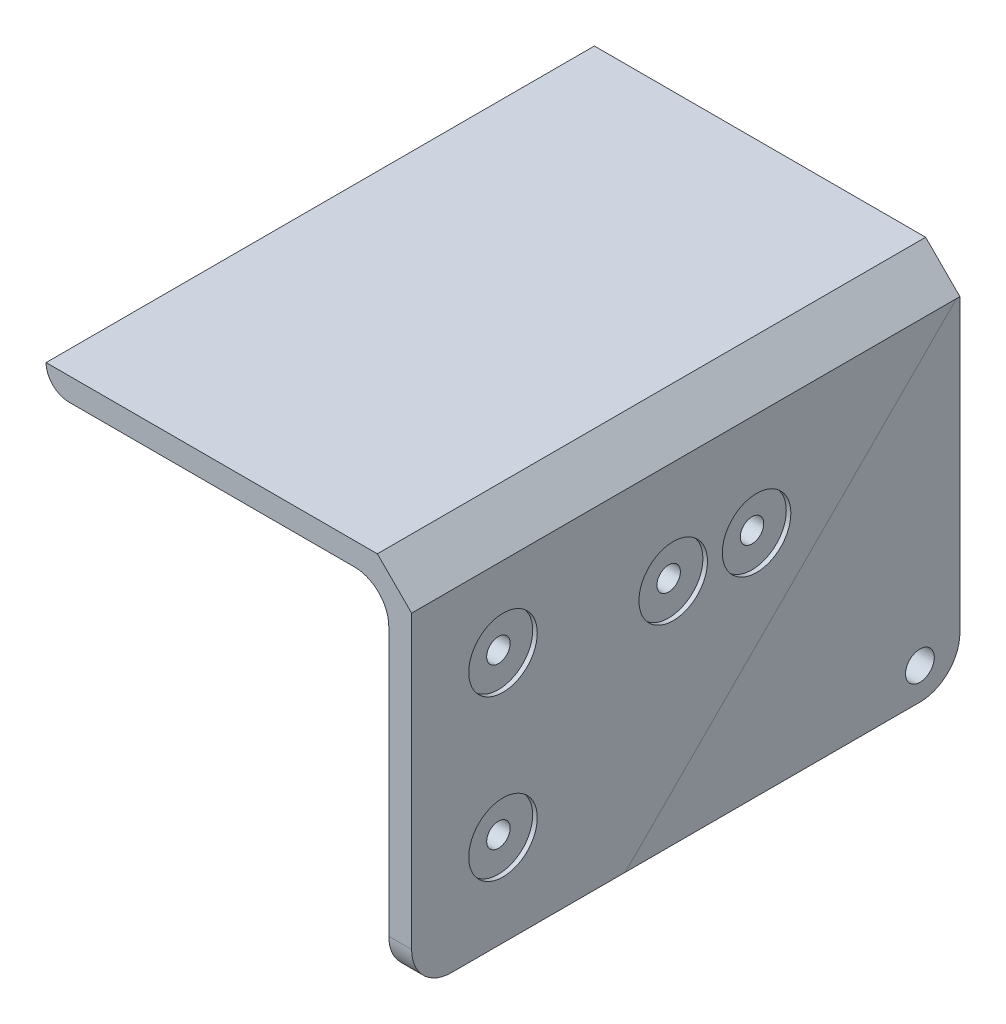
ISO-10303-21;
HEADER;
FILE_DESCRIPTION(('STEP AP214'),'2;1');
FILE_NAME('part.step','',(''),(''),'','','');
FILE_SCHEMA(('AUTOMOTIVE_DESIGN { 1 0 10303 214 1 1 1 1 }'));
ENDSEC;
DATA;
#1=APPLICATION_CONTEXT('core data for automotive mechanical design processes');
#2=APPLICATION_PROTOCOL_DEFINITION('international standard','automotive_design',2000,#1);
#3=PRODUCT_CONTEXT('',#1,'mechanical');
#4=PRODUCT('Part','Part','',(#3));
#5=PRODUCT_RELATED_PRODUCT_CATEGORY('part','',(#4));
#6=PRODUCT_DEFINITION_FORMATION('','',#4);
#7=PRODUCT_DEFINITION_CONTEXT('part definition',#1,'design');
#8=PRODUCT_DEFINITION('design','',#6,#7);
#9=PRODUCT_DEFINITION_SHAPE('','',#8);
#10=(LENGTH_UNIT() NAMED_UNIT(*) SI_UNIT(.MILLI.,.METRE.));
#11=(NAMED_UNIT(*) PLANE_ANGLE_UNIT() SI_UNIT($,.RADIAN.));
#12=(NAMED_UNIT(*) SI_UNIT($,.STERADIAN.) SOLID_ANGLE_UNIT());
#13=UNCERTAINTY_MEASURE_WITH_UNIT(LENGTH_MEASURE(1.E-05),#10,'distance_accuracy_value','');
#14=(GEOMETRIC_REPRESENTATION_CONTEXT(3) GLOBAL_UNCERTAINTY_ASSIGNED_CONTEXT((#13)) GLOBAL_UNIT_ASSIGNED_CONTEXT((#10,
#11,#12)) REPRESENTATION_CONTEXT('',''));
#15=CARTESIAN_POINT('',(0.,0.,0.));
#16=DIRECTION('',(0.,0.,1.));
#17=DIRECTION('',(1.,0.,0.));
#18=AXIS2_PLACEMENT_3D('',#15,#16,#17);
#19=CARTESIAN_POINT('',(0.,-61.8500668000245,-11.1125));
#20=DIRECTION('',(1.,0.,0.));
#21=DIRECTION('',(0.,0.,-1.));
#22=AXIS2_PLACEMENT_3D('',#19,#20,#21);
#23=PLANE('',#22);
#24=CARTESIAN_POINT('',(0.,-36.4500668000245,115.8875));
#25=DIRECTION('',(1.,0.,0.));
#26=DIRECTION('',(0.,0.,-1.));
#27=AXIS2_PLACEMENT_3D('',#24,#25,#26);
#28=CIRCLE('',#27,9.52500000000001);
#29=CARTESIAN_POINT('',(0.,-36.4500668000245,106.3625));
#30=VERTEX_POINT('',#29);
#31=EDGE_CURVE('E326',#30,#30,#28,.T.);
#32=ORIENTED_EDGE('',*,*,#31,.F.);
#33=EDGE_LOOP('',(#32));
#34=FACE_BOUND('',#33,.T.);
#35=CARTESIAN_POINT('',(0.,1.58750000000024,45.3997455688339));
#36=DIRECTION('',(1.,0.,0.));
#37=DIRECTION('',(0.,0.,-1.));
#38=AXIS2_PLACEMENT_3D('',#35,#36,#37);
#39=CIRCLE('',#38,9.52500000000001);
#40=CARTESIAN_POINT('',(0.,1.58750000000024,35.8747455688339));
#41=VERTEX_POINT('',#40);
#42=EDGE_CURVE('E317',#41,#41,#39,.T.);
#43=ORIENTED_EDGE('',*,*,#42,.F.);
#44=EDGE_LOOP('',(#43));
#45=FACE_BOUND('',#44,.T.);
#46=CARTESIAN_POINT('',(0.,1.58750000000024,68.5761787688339));
#47=DIRECTION('',(1.,0.,0.));
#48=DIRECTION('',(0.,0.,-1.));
#49=AXIS2_PLACEMENT_3D('',#46,#47,#48);
#50=CIRCLE('',#49,9.525);
#51=CARTESIAN_POINT('',(0.,1.58750000000024,59.0511787688339));
#52=VERTEX_POINT('',#51);
#53=EDGE_CURVE('E333',#52,#52,#50,.T.);
#54=ORIENTED_EDGE('',*,*,#53,.F.);
#55=EDGE_LOOP('',(#54));
#56=FACE_BOUND('',#55,.T.);
#57=CARTESIAN_POINT('',(0.,7.99993319997549,115.8875));
#58=DIRECTION('',(1.,0.,0.));
#59=DIRECTION('',(0.,0.,-1.));
#60=AXIS2_PLACEMENT_3D('',#57,#58,#59);
#61=CIRCLE('',#60,9.52500000000001);
#62=CARTESIAN_POINT('',(0.,7.99993319997549,106.3625));
#63=VERTEX_POINT('',#62);
#64=EDGE_CURVE('E307',#63,#63,#61,.T.);
#65=ORIENTED_EDGE('',*,*,#64,.F.);
#66=EDGE_LOOP('',(#65));
#67=FACE_BOUND('',#66,.T.);
#68=CARTESIAN_POINT('',(0.,-50.7375668000245,130.175));
#69=DIRECTION('',(-1.,0.,0.));
#70=DIRECTION('',(0.,0.,-1.));
#71=AXIS2_PLACEMENT_3D('',#68,#69,#70);
#72=CIRCLE('',#71,11.1125);
#73=CARTESIAN_POINT('',(0.,-61.8500668000245,130.175));
#74=VERTEX_POINT('',#73);
#75=CARTESIAN_POINT('',(0.,-50.7375668000245,141.2875));
#76=VERTEX_POINT('',#75);
#77=EDGE_CURVE('E347',#74,#76,#72,.T.);
#78=ORIENTED_EDGE('',*,*,#77,.F.);
#79=DIRECTION('',(0.,0.,1.));
#80=VECTOR('',#79,1.);
#81=CARTESIAN_POINT('',(0.,-61.8500668000245,-11.1125));
#82=LINE('',#81,#80);
#83=CARTESIAN_POINT('',(0.,-61.8500668000245,81.8965440056519));
#84=VERTEX_POINT('',#83);
#85=EDGE_CURVE('E175',#84,#74,#82,.T.);
#86=ORIENTED_EDGE('',*,*,#85,.F.);
#87=DIRECTION('',(0.,0.707106781186544,-0.707106781186551));
#88=VECTOR('',#87,1.);
#89=CARTESIAN_POINT('',(0.,-15.3455447971985,35.3920220028255));
#90=LINE('',#89,#88);
#91=CARTESIAN_POINT('',(0.,30.2249331999755,-10.178455994349));
#92=VERTEX_POINT('',#91);
#93=EDGE_CURVE('E359',#84,#92,#90,.T.);
#94=ORIENTED_EDGE('',*,*,#93,.T.);
#95=DIRECTION('',(0.,0.,1.));
#96=VECTOR('',#95,1.);
#97=CARTESIAN_POINT('',(0.,30.2249331999754,-11.1125));
#98=LINE('',#97,#96);
#99=CARTESIAN_POINT('',(0.,30.2249331999754,141.2875));
#100=VERTEX_POINT('',#99);
#101=EDGE_CURVE('E220',#92,#100,#98,.T.);
#102=ORIENTED_EDGE('',*,*,#101,.T.);
#103=DIRECTION('',(0.,1.,0.));
#104=VECTOR('',#103,1.);
#105=CARTESIAN_POINT('',(0.,-61.8500668000245,141.2875));
#106=LINE('',#105,#104);
#107=EDGE_CURVE('E283',#76,#100,#106,.T.);
#108=ORIENTED_EDGE('',*,*,#107,.F.);
#109=EDGE_LOOP('',(#78,#86,#94,#102,#108));
#110=FACE_BOUND('',#109,.T.);
#111=ADVANCED_FACE('F49',(#34,#45,#56,#67,#110),#23,.T.);
#112=CARTESIAN_POINT('',(0.,-53.06222052,0.));
#113=DIRECTION('',(1.,0.,0.));
#114=DIRECTION('',(0.,0.,-1.));
#115=AXIS2_PLACEMENT_3D('',#112,#113,#114);
#116=CIRCLE('',#115,4.000000001);
#117=CARTESIAN_POINT('',(0.,-53.06222052,-4.00000000100001));
#118=VERTEX_POINT('',#117);
#119=EDGE_CURVE('E302',#118,#118,#116,.T.);
#120=ORIENTED_EDGE('',*,*,#119,.F.);
#121=EDGE_LOOP('',(#120));
#122=FACE_BOUND('',#121,.T.);
#123=CARTESIAN_POINT('',(0.,-50.7375668000245,0.));
#124=DIRECTION('',(-1.,0.,0.));
#125=DIRECTION('',(0.,0.,-1.));
#126=AXIS2_PLACEMENT_3D('',#123,#124,#125);
#127=CIRCLE('',#126,11.1125);
#128=CARTESIAN_POINT('',(0.,-50.7375668000245,-11.1125));
#129=VERTEX_POINT('',#128);
#130=CARTESIAN_POINT('',(0.,-61.8500668000245,0.));
#131=VERTEX_POINT('',#130);
#132=EDGE_CURVE('E79',#129,#131,#127,.T.);
#133=ORIENTED_EDGE('',*,*,#132,.F.);
#134=DIRECTION('',(0.,1.,0.));
#135=VECTOR('',#134,1.);
#136=CARTESIAN_POINT('',(0.,-61.8500668000245,-11.1125));
#137=LINE('',#136,#135);
#138=CARTESIAN_POINT('',(0.,30.2249331999754,-11.1125));
#139=VERTEX_POINT('',#138);
#140=EDGE_CURVE('E156',#129,#139,#137,.T.);
#141=ORIENTED_EDGE('',*,*,#140,.T.);
#142=EDGE_CURVE('E362',#139,#92,#98,.T.);
#143=ORIENTED_EDGE('',*,*,#142,.T.);
#144=ORIENTED_EDGE('',*,*,#93,.F.);
#145=EDGE_CURVE('E159',#131,#84,#82,.T.);
#146=ORIENTED_EDGE('',*,*,#145,.F.);
#147=EDGE_LOOP('',(#133,#141,#143,#144,#146));
#148=FACE_BOUND('',#147,.T.);
#149=ADVANCED_FACE('F154',(#122,#148),#23,.T.);
#150=CARTESIAN_POINT('',(-6.35,-61.8500668000245,-11.1125));
#151=DIRECTION('',(1.,0.,0.));
#152=DIRECTION('',(0.,0.,-1.));
#153=AXIS2_PLACEMENT_3D('',#150,#151,#152);
#154=PLANE('',#153);
#155=CARTESIAN_POINT('',(-6.34999999999999,1.58750000000024,68.5761787688339));
#156=DIRECTION('',(1.,0.,0.));
#157=DIRECTION('',(0.,0.,-1.));
#158=AXIS2_PLACEMENT_3D('',#155,#156,#157);
#159=CIRCLE('',#158,3.26389999999999);
#160=CARTESIAN_POINT('',(-6.34999999999999,1.58750000000024,65.3122787688339));
#161=VERTEX_POINT('',#160);
#162=EDGE_CURVE('E297',#161,#161,#159,.T.);
#163=ORIENTED_EDGE('',*,*,#162,.T.);
#164=EDGE_LOOP('',(#163));
#165=FACE_BOUND('',#164,.T.);
#166=CARTESIAN_POINT('',(-6.34999999999999,1.58750000000024,45.3997455688339));
#167=DIRECTION('',(1.,0.,0.));
#168=DIRECTION('',(0.,0.,-1.));
#169=AXIS2_PLACEMENT_3D('',#166,#167,#168);
#170=CIRCLE('',#169,3.2639);
#171=CARTESIAN_POINT('',(-6.34999999999999,1.58750000000024,42.1358455688339));
#172=VERTEX_POINT('',#171);
#173=EDGE_CURVE('E442',#172,#172,#170,.T.);
#174=ORIENTED_EDGE('',*,*,#173,.T.);
#175=EDGE_LOOP('',(#174));
#176=FACE_BOUND('',#175,.T.);
#177=CARTESIAN_POINT('',(-6.34999999999999,-36.4500668000245,115.8875));
#178=DIRECTION('',(1.,0.,0.));
#179=DIRECTION('',(0.,0.,-1.));
#180=AXIS2_PLACEMENT_3D('',#177,#178,#179);
#181=CIRCLE('',#180,3.2639);
#182=CARTESIAN_POINT('',(-6.34999999999999,-36.4500668000245,112.6236));
#183=VERTEX_POINT('',#182);
#184=EDGE_CURVE('E447',#183,#183,#181,.T.);
#185=ORIENTED_EDGE('',*,*,#184,.T.);
#186=EDGE_LOOP('',(#185));
#187=FACE_BOUND('',#186,.T.);
#188=CARTESIAN_POINT('',(-6.34999999999999,7.99993319997549,115.8875));
#189=DIRECTION('',(1.,0.,0.));
#190=DIRECTION('',(0.,0.,-1.));
#191=AXIS2_PLACEMENT_3D('',#188,#189,#190);
#192=CIRCLE('',#191,3.26389999999999);
#193=CARTESIAN_POINT('',(-6.34999999999999,7.99993319997549,112.6236));
#194=VERTEX_POINT('',#193);
#195=EDGE_CURVE('E221',#194,#194,#192,.T.);
#196=ORIENTED_EDGE('',*,*,#195,.T.);
#197=EDGE_LOOP('',(#196));
#198=FACE_BOUND('',#197,.T.);
#199=DIRECTION('',(0.,1.,0.));
#200=VECTOR('',#199,1.);
#201=CARTESIAN_POINT('',(-6.35,-61.8500668000245,-11.1125));
#202=LINE('',#201,#200);
#203=CARTESIAN_POINT('',(-6.34999999999999,-50.7375668000245,-11.1125));
#204=VERTEX_POINT('',#203);
#205=CARTESIAN_POINT('',(-6.35,23.8749331999755,-11.1125));
#206=VERTEX_POINT('',#205);
#207=EDGE_CURVE('E170',#204,#206,#202,.T.);
#208=ORIENTED_EDGE('',*,*,#207,.F.);
#209=CARTESIAN_POINT('',(-6.34999999999999,-50.7375668000245,0.));
#210=DIRECTION('',(1.,0.,0.));
#211=DIRECTION('',(0.,0.,-1.));
#212=AXIS2_PLACEMENT_3D('',#209,#210,#211);
#213=CIRCLE('',#212,11.1125);
#214=CARTESIAN_POINT('',(-6.35,-55.5000668000245,-10.0402315710346));
#215=VERTEX_POINT('',#214);
#216=EDGE_CURVE('E146',#204,#215,#213,.F.);
#217=ORIENTED_EDGE('',*,*,#216,.T.);
#218=DIRECTION('',(0.,0.,1.));
#219=VECTOR('',#218,1.);
#220=CARTESIAN_POINT('',(-6.35,-55.5000668000245,-11.1125));
#221=LINE('',#220,#219);
#222=CARTESIAN_POINT('',(-6.35,-55.5000668000245,-3.17126244939943));
#223=VERTEX_POINT('',#222);
#224=EDGE_CURVE('E199',#215,#223,#221,.T.);
#225=ORIENTED_EDGE('',*,*,#224,.T.);
#226=CARTESIAN_POINT('',(-6.34999999999999,-53.06222052,0.));
#227=DIRECTION('',(1.,0.,0.));
#228=DIRECTION('',(0.,0.,-1.));
#229=AXIS2_PLACEMENT_3D('',#226,#227,#228);
#230=CIRCLE('',#229,4.000000001);
#231=CARTESIAN_POINT('',(-6.35,-55.5000668000245,3.17126244939941));
#232=VERTEX_POINT('',#231);
#233=EDGE_CURVE('E298',#223,#232,#230,.T.);
#234=ORIENTED_EDGE('',*,*,#233,.T.);
#235=CARTESIAN_POINT('',(-6.35,-55.5000668000245,140.215231571035));
#236=VERTEX_POINT('',#235);
#237=EDGE_CURVE('E198',#232,#236,#221,.T.);
#238=ORIENTED_EDGE('',*,*,#237,.T.);
#239=CARTESIAN_POINT('',(-6.34999999999999,-50.7375668000245,130.175));
#240=DIRECTION('',(1.,0.,0.));
#241=DIRECTION('',(0.,0.,-1.));
#242=AXIS2_PLACEMENT_3D('',#239,#240,#241);
#243=CIRCLE('',#242,11.1125);
#244=CARTESIAN_POINT('',(-6.34999999999999,-50.7375668000245,141.2875));
#245=VERTEX_POINT('',#244);
#246=EDGE_CURVE('E72',#236,#245,#243,.F.);
#247=ORIENTED_EDGE('',*,*,#246,.T.);
#248=DIRECTION('',(0.,1.,0.));
#249=VECTOR('',#248,1.);
#250=CARTESIAN_POINT('',(-6.35,-61.8500668000245,141.2875));
#251=LINE('',#250,#249);
#252=CARTESIAN_POINT('',(-6.35,23.8749331999755,141.2875));
#253=VERTEX_POINT('',#252);
#254=EDGE_CURVE('E288',#245,#253,#251,.T.);
#255=ORIENTED_EDGE('',*,*,#254,.T.);
#256=DIRECTION('',(0.,0.,1.));
#257=VECTOR('',#256,1.);
#258=CARTESIAN_POINT('',(-6.35,23.8749331999755,-11.1125));
#259=LINE('',#258,#257);
#260=EDGE_CURVE('E187',#253,#206,#259,.F.);
#261=ORIENTED_EDGE('',*,*,#260,.T.);
#262=EDGE_LOOP('',(#208,#217,#225,#234,#238,#247,#255,#261));
#263=FACE_BOUND('',#262,.T.);
#264=ADVANCED_FACE('F251',(#165,#176,#187,#198,#263),#154,.F.);
#265=CARTESIAN_POINT('',(0.,0.,-11.1125));
#266=DIRECTION('',(0.,0.,-1.));
#267=DIRECTION('',(-1.,0.,0.));
#268=AXIS2_PLACEMENT_3D('',#265,#266,#267);
#269=PLANE('',#268);
#270=ORIENTED_EDGE('',*,*,#140,.F.);
#271=DIRECTION('',(1.,0.,0.));
#272=VECTOR('',#271,1.);
#273=CARTESIAN_POINT('',(-101.6,-50.7375668000245,-11.1125));
#274=LINE('',#273,#272);
#275=EDGE_CURVE('E143',#204,#129,#274,.T.);
#276=ORIENTED_EDGE('',*,*,#275,.F.);
#277=ORIENTED_EDGE('',*,*,#207,.T.);
#278=CARTESIAN_POINT('',(-15.875,23.8749331999755,-11.1125));
#279=DIRECTION('',(0.,0.,-1.));
#280=DIRECTION('',(-1.,0.,0.));
#281=AXIS2_PLACEMENT_3D('',#278,#279,#280);
#282=CIRCLE('',#281,9.525);
#283=CARTESIAN_POINT('',(-15.875,33.3999331999755,-11.1125));
#284=VERTEX_POINT('',#283);
#285=EDGE_CURVE('E195',#206,#284,#282,.F.);
#286=ORIENTED_EDGE('',*,*,#285,.T.);
#287=DIRECTION('',(-1.,0.,0.));
#288=VECTOR('',#287,1.);
#289=CARTESIAN_POINT('',(0.,33.3999331999755,-11.1125));
#290=LINE('',#289,#288);
#291=CARTESIAN_POINT('',(-95.25,33.3999331999755,-11.1125));
#292=VERTEX_POINT('',#291);
#293=EDGE_CURVE('E177',#284,#292,#290,.T.);
#294=ORIENTED_EDGE('',*,*,#293,.T.);
#295=CARTESIAN_POINT('',(-95.25,39.7499331999755,-11.1125));
#296=DIRECTION('',(0.,0.,-1.));
#297=DIRECTION('',(-1.,0.,0.));
#298=AXIS2_PLACEMENT_3D('',#295,#296,#297);
#299=CIRCLE('',#298,6.35);
#300=CARTESIAN_POINT('',(-101.6,39.7499331999755,-11.1125));
#301=VERTEX_POINT('',#300);
#302=EDGE_CURVE('E205',#292,#301,#299,.T.);
#303=ORIENTED_EDGE('',*,*,#302,.T.);
#304=DIRECTION('',(-1.,0.,0.));
#305=VECTOR('',#304,1.);
#306=CARTESIAN_POINT('',(0.,39.7499331999755,-11.1125));
#307=LINE('',#306,#305);
#308=CARTESIAN_POINT('',(-9.52500000000008,39.7499331999755,-11.1125));
#309=VERTEX_POINT('',#308);
#310=EDGE_CURVE('E281',#309,#301,#307,.T.);
#311=ORIENTED_EDGE('',*,*,#310,.F.);
#312=DIRECTION('',(-0.707106781186548,0.707106781186547,0.));
#313=VECTOR('',#312,1.);
#314=CARTESIAN_POINT('',(15.1124665999877,15.1124665999877,-11.1125));
#315=LINE('',#314,#313);
#316=EDGE_CURVE('E166',#309,#139,#315,.F.);
#317=ORIENTED_EDGE('',*,*,#316,.T.);
#318=EDGE_LOOP('',(#270,#276,#277,#286,#294,#303,#311,#317));
#319=FACE_BOUND('',#318,.T.);
#320=ADVANCED_FACE('F163',(#319),#269,.T.);
#321=CARTESIAN_POINT('',(0.,0.,141.2875));
#322=DIRECTION('',(0.,0.,-1.));
#323=DIRECTION('',(-1.,0.,0.));
#324=AXIS2_PLACEMENT_3D('',#321,#322,#323);
#325=PLANE('',#324);
#326=DIRECTION('',(1.,0.,0.));
#327=VECTOR('',#326,1.);
#328=CARTESIAN_POINT('',(-101.6,-50.7375668000245,141.2875));
#329=LINE('',#328,#327);
#330=EDGE_CURVE('E161',#245,#76,#329,.T.);
#331=ORIENTED_EDGE('',*,*,#330,.T.);
#332=ORIENTED_EDGE('',*,*,#107,.T.);
#333=DIRECTION('',(0.707106781186548,-0.707106781186547,0.));
#334=VECTOR('',#333,1.);
#335=CARTESIAN_POINT('',(0.,30.2249331999754,141.2875));
#336=LINE('',#335,#334);
#337=CARTESIAN_POINT('',(-9.52500000000008,39.7499331999755,141.2875));
#338=VERTEX_POINT('',#337);
#339=EDGE_CURVE('E365',#100,#338,#336,.F.);
#340=ORIENTED_EDGE('',*,*,#339,.T.);
#341=DIRECTION('',(-1.,0.,0.));
#342=VECTOR('',#341,1.);
#343=CARTESIAN_POINT('',(0.,39.7499331999755,141.2875));
#344=LINE('',#343,#342);
#345=CARTESIAN_POINT('',(-101.6,39.7499331999755,141.2875));
#346=VERTEX_POINT('',#345);
#347=EDGE_CURVE('E294',#338,#346,#344,.T.);
#348=ORIENTED_EDGE('',*,*,#347,.T.);
#349=CARTESIAN_POINT('',(-95.25,39.7499331999755,141.2875));
#350=DIRECTION('',(0.,0.,-1.));
#351=DIRECTION('',(-1.,0.,0.));
#352=AXIS2_PLACEMENT_3D('',#349,#350,#351);
#353=CIRCLE('',#352,6.35);
#354=CARTESIAN_POINT('',(-95.25,33.3999331999755,141.2875));
#355=VERTEX_POINT('',#354);
#356=EDGE_CURVE('E202',#346,#355,#353,.F.);
#357=ORIENTED_EDGE('',*,*,#356,.T.);
#358=DIRECTION('',(-1.,0.,0.));
#359=VECTOR('',#358,1.);
#360=CARTESIAN_POINT('',(0.,33.3999331999755,141.2875));
#361=LINE('',#360,#359);
#362=CARTESIAN_POINT('',(-15.875,33.3999331999755,141.2875));
#363=VERTEX_POINT('',#362);
#364=EDGE_CURVE('E291',#363,#355,#361,.T.);
#365=ORIENTED_EDGE('',*,*,#364,.F.);
#366=CARTESIAN_POINT('',(-15.875,23.8749331999755,141.2875));
#367=DIRECTION('',(0.,0.,-1.));
#368=DIRECTION('',(-1.,0.,0.));
#369=AXIS2_PLACEMENT_3D('',#366,#367,#368);
#370=CIRCLE('',#369,9.525);
#371=EDGE_CURVE('E191',#363,#253,#370,.T.);
#372=ORIENTED_EDGE('',*,*,#371,.T.);
#373=ORIENTED_EDGE('',*,*,#254,.F.);
#374=EDGE_LOOP('',(#331,#332,#340,#348,#357,#365,#372,#373));
#375=FACE_BOUND('',#374,.T.);
#376=ADVANCED_FACE('F244',(#375),#325,.F.);
#377=CARTESIAN_POINT('',(-101.6,7.99993319997549,115.8875));
#378=DIRECTION('',(1.,0.,0.));
#379=DIRECTION('',(0.,0.,-1.));
#380=AXIS2_PLACEMENT_3D('',#377,#378,#379);
#381=CYLINDRICAL_SURFACE('',#380,3.26389999999999);
#382=ORIENTED_EDGE('',*,*,#195,.F.);
#383=EDGE_LOOP('',(#382));
#384=FACE_BOUND('',#383,.T.);
#385=CARTESIAN_POINT('',(-1.26999999999999,7.99993319997549,115.8875));
#386=DIRECTION('',(1.,0.,0.));
#387=DIRECTION('',(0.,0.,-1.));
#388=AXIS2_PLACEMENT_3D('',#385,#386,#387);
#389=CIRCLE('',#388,3.26389999999999);
#390=CARTESIAN_POINT('',(-1.26999999999999,7.99993319997549,112.6236));
#391=VERTEX_POINT('',#390);
#392=EDGE_CURVE('E306',#391,#391,#389,.F.);
#393=ORIENTED_EDGE('',*,*,#392,.F.);
#394=EDGE_LOOP('',(#393));
#395=FACE_BOUND('',#394,.T.);
#396=ADVANCED_FACE('F241',(#384,#395),#381,.F.);
#397=CARTESIAN_POINT('',(-101.6,-36.4500668000245,115.8875));
#398=DIRECTION('',(1.,0.,0.));
#399=DIRECTION('',(0.,0.,-1.));
#400=AXIS2_PLACEMENT_3D('',#397,#398,#399);
#401=CYLINDRICAL_SURFACE('',#400,3.2639);
#402=ORIENTED_EDGE('',*,*,#184,.F.);
#403=EDGE_LOOP('',(#402));
#404=FACE_BOUND('',#403,.T.);
#405=CARTESIAN_POINT('',(-1.26999999999999,-36.4500668000245,115.8875));
#406=DIRECTION('',(1.,0.,0.));
#407=DIRECTION('',(0.,0.,-1.));
#408=AXIS2_PLACEMENT_3D('',#405,#406,#407);
#409=CIRCLE('',#408,3.2639);
#410=CARTESIAN_POINT('',(-1.26999999999999,-36.4500668000245,112.6236));
#411=VERTEX_POINT('',#410);
#412=EDGE_CURVE('E384',#411,#411,#409,.F.);
#413=ORIENTED_EDGE('',*,*,#412,.F.);
#414=EDGE_LOOP('',(#413));
#415=FACE_BOUND('',#414,.T.);
#416=ADVANCED_FACE('F233',(#404,#415),#401,.F.);
#417=CARTESIAN_POINT('',(-101.6,1.58750000000024,45.3997455688339));
#418=DIRECTION('',(1.,0.,0.));
#419=DIRECTION('',(0.,0.,-1.));
#420=AXIS2_PLACEMENT_3D('',#417,#418,#419);
#421=CYLINDRICAL_SURFACE('',#420,3.2639);
#422=ORIENTED_EDGE('',*,*,#173,.F.);
#423=EDGE_LOOP('',(#422));
#424=FACE_BOUND('',#423,.T.);
#425=CARTESIAN_POINT('',(-1.26999999999999,1.58750000000024,45.3997455688339));
#426=DIRECTION('',(1.,0.,0.));
#427=DIRECTION('',(0.,0.,-1.));
#428=AXIS2_PLACEMENT_3D('',#425,#426,#427);
#429=CIRCLE('',#428,3.2639);
#430=CARTESIAN_POINT('',(-1.26999999999999,1.58750000000024,42.1358455688339));
#431=VERTEX_POINT('',#430);
#432=EDGE_CURVE('E380',#431,#431,#429,.F.);
#433=ORIENTED_EDGE('',*,*,#432,.F.);
#434=EDGE_LOOP('',(#433));
#435=FACE_BOUND('',#434,.T.);
#436=ADVANCED_FACE('F239',(#424,#435),#421,.F.);
#437=CARTESIAN_POINT('',(-101.6,1.58750000000024,68.5761787688339));
#438=DIRECTION('',(1.,0.,0.));
#439=DIRECTION('',(0.,0.,-1.));
#440=AXIS2_PLACEMENT_3D('',#437,#438,#439);
#441=CYLINDRICAL_SURFACE('',#440,3.26389999999999);
#442=ORIENTED_EDGE('',*,*,#162,.F.);
#443=EDGE_LOOP('',(#442));
#444=FACE_BOUND('',#443,.T.);
#445=CARTESIAN_POINT('',(-1.26999999999999,1.58750000000024,68.5761787688339));
#446=DIRECTION('',(1.,0.,0.));
#447=DIRECTION('',(0.,0.,-1.));
#448=AXIS2_PLACEMENT_3D('',#445,#446,#447);
#449=CIRCLE('',#448,3.26389999999999);
#450=CARTESIAN_POINT('',(-1.26999999999999,1.58750000000024,65.3122787688339));
#451=VERTEX_POINT('',#450);
#452=EDGE_CURVE('E316',#451,#451,#449,.F.);
#453=ORIENTED_EDGE('',*,*,#452,.F.);
#454=EDGE_LOOP('',(#453));
#455=FACE_BOUND('',#454,.T.);
#456=ADVANCED_FACE('F235',(#444,#455),#441,.F.);
#457=CARTESIAN_POINT('',(0.,39.7499331999755,-11.1125));
#458=DIRECTION('',(0.,1.,0.));
#459=DIRECTION('',(-1.,0.,0.));
#460=AXIS2_PLACEMENT_3D('',#457,#458,#459);
#461=PLANE('',#460);
#462=ORIENTED_EDGE('',*,*,#347,.F.);
#463=DIRECTION('',(0.,0.,-1.));
#464=VECTOR('',#463,1.);
#465=CARTESIAN_POINT('',(-9.52500000000008,39.7499331999755,-11.1125));
#466=LINE('',#465,#464);
#467=EDGE_CURVE('E366',#338,#309,#466,.T.);
#468=ORIENTED_EDGE('',*,*,#467,.T.);
#469=ORIENTED_EDGE('',*,*,#310,.T.);
#470=DIRECTION('',(0.,0.,1.));
#471=VECTOR('',#470,1.);
#472=CARTESIAN_POINT('',(-101.6,39.7499331999755,-11.1125));
#473=LINE('',#472,#471);
#474=EDGE_CURVE('E169',#301,#346,#473,.T.);
#475=ORIENTED_EDGE('',*,*,#474,.T.);
#476=EDGE_LOOP('',(#462,#468,#469,#475));
#477=FACE_BOUND('',#476,.T.);
#478=ADVANCED_FACE('F238',(#477),#461,.T.);
#479=CARTESIAN_POINT('',(0.,33.3999331999755,-11.1125));
#480=DIRECTION('',(0.,1.,0.));
#481=DIRECTION('',(-1.,0.,0.));
#482=AXIS2_PLACEMENT_3D('',#479,#480,#481);
#483=PLANE('',#482);
#484=ORIENTED_EDGE('',*,*,#364,.T.);
#485=DIRECTION('',(0.,0.,1.));
#486=VECTOR('',#485,1.);
#487=CARTESIAN_POINT('',(-95.25,33.3999331999755,-11.1125));
#488=LINE('',#487,#486);
#489=EDGE_CURVE('E209',#355,#292,#488,.F.);
#490=ORIENTED_EDGE('',*,*,#489,.T.);
#491=ORIENTED_EDGE('',*,*,#293,.F.);
#492=DIRECTION('',(0.,0.,1.));
#493=VECTOR('',#492,1.);
#494=CARTESIAN_POINT('',(-15.875,33.3999331999755,141.2875));
#495=LINE('',#494,#493);
#496=EDGE_CURVE('E182',#284,#363,#495,.T.);
#497=ORIENTED_EDGE('',*,*,#496,.T.);
#498=EDGE_LOOP('',(#484,#490,#491,#497));
#499=FACE_BOUND('',#498,.T.);
#500=ADVANCED_FACE('F258',(#499),#483,.F.);
#501=CARTESIAN_POINT('',(-15.875,23.8749331999755,-11.1125));
#502=DIRECTION('',(0.,0.,-1.));
#503=DIRECTION('',(-1.,0.,0.));
#504=AXIS2_PLACEMENT_3D('',#501,#502,#503);
#505=CYLINDRICAL_SURFACE('',#504,9.525);
#506=ORIENTED_EDGE('',*,*,#285,.F.);
#507=ORIENTED_EDGE('',*,*,#260,.F.);
#508=ORIENTED_EDGE('',*,*,#371,.F.);
#509=ORIENTED_EDGE('',*,*,#496,.F.);
#510=EDGE_LOOP('',(#506,#507,#508,#509));
#511=FACE_BOUND('',#510,.T.);
#512=ADVANCED_FACE('F261',(#511),#505,.F.);
#513=CARTESIAN_POINT('',(0.,-55.5000668000245,-11.1125));
#514=DIRECTION('',(0.,0.,1.));
#515=DIRECTION('',(1.,0.,0.));
#516=AXIS2_PLACEMENT_3D('',#513,#514,#515);
#517=CYLINDRICAL_SURFACE('',#516,6.35);
#518=CARTESIAN_POINT('',(-6.35,-55.5000668000245,-10.0402315710346));
#519=CARTESIAN_POINT('',(-6.35000039678201,-55.5962443275717,-9.99461275051477));
#520=CARTESIAN_POINT('',(-6.34781474422707,-55.6917443741692,-9.94761760930693));
#521=CARTESIAN_POINT('',(-6.33926132196278,-55.8811901436043,-9.85099450440224));
#522=CARTESIAN_POINT('',(-6.33289439517833,-55.9751361758111,-9.8013670732157));
#523=CARTESIAN_POINT('',(-6.30783648455553,-56.2540536925487,-9.64887804613765));
#524=CARTESIAN_POINT('',(-6.28318692582915,-56.4364658397739,-9.54223816269277));
#525=CARTESIAN_POINT('',(-6.21992661407426,-56.7912572118891,-9.32114621148438));
#526=CARTESIAN_POINT('',(-6.18146103770912,-56.9637198851272,-9.20678506641953));
#527=CARTESIAN_POINT('',(-6.09206578178577,-57.2999301357013,-8.97024639570763));
#528=CARTESIAN_POINT('',(-6.04112947649193,-57.4636730236985,-8.84806474057055));
#529=CARTESIAN_POINT('',(-5.91262039637367,-57.8259892737106,-8.56206373646526));
#530=CARTESIAN_POINT('',(-5.83157794655952,-58.0216350789559,-8.39609111136832));
#531=CARTESIAN_POINT('',(-5.6543586728754,-58.397286206566,-8.05486128128436));
#532=CARTESIAN_POINT('',(-5.55817947496464,-58.5772890686131,-7.879602622745));
#533=CARTESIAN_POINT('',(-5.35261595741027,-58.9224248185763,-7.52050948664047));
#534=CARTESIAN_POINT('',(-5.24317148155174,-59.0874835494363,-7.33663845215076));
#535=CARTESIAN_POINT('',(-5.01353079468896,-59.4019796879693,-6.96242487359764));
#536=CARTESIAN_POINT('',(-4.89333389260713,-59.5514160902268,-6.77208191406018));
#537=CARTESIAN_POINT('',(-4.59381346619319,-59.8920466702383,-6.30840135807412));
#538=CARTESIAN_POINT('',(-4.41014132133746,-60.0758863522077,-6.03245259748237));
#539=CARTESIAN_POINT('',(-4.0290902470866,-60.4147356732291,-5.47240833145388));
#540=CARTESIAN_POINT('',(-3.83170571761326,-60.5697334371762,-5.18830952571148));
#541=CARTESIAN_POINT('',(-3.4264230956332,-60.8519915063009,-4.61394117385852));
#542=CARTESIAN_POINT('',(-3.21852448248839,-60.9792504362422,-4.32367132258248));
#543=CARTESIAN_POINT('',(-2.79484362063115,-61.2070086797036,-3.73858052574638));
#544=CARTESIAN_POINT('',(-2.57906297371845,-61.3075133962297,-3.44376051183331));
#545=CARTESIAN_POINT('',(-2.17020163773882,-61.47122078888,-2.88939476509835));
#546=CARTESIAN_POINT('',(-1.97782445412813,-61.5375768020167,-2.63025550666378));
#547=CARTESIAN_POINT('',(-1.58994817192293,-61.6511169463899,-2.11020129475761));
#548=CARTESIAN_POINT('',(-1.39444895460755,-61.6983003467409,-1.84928627397703));
#549=CARTESIAN_POINT('',(-0.805578839168144,-61.8114119234414,-1.06569862324197));
#550=CARTESIAN_POINT('',(-0.408918760161435,-61.8492610996581,-0.540948862026499));
#551=CARTESIAN_POINT('',(-0.00847569751694118,-61.8500625546222,-0.0112122955268455));
#552=CARTESIAN_POINT('',(-0.00423781976693714,-61.8500667968691,-0.00560611025110095));
#553=CARTESIAN_POINT('',(0.,-61.8500668000245,0.));
#554=B_SPLINE_CURVE_WITH_KNOTS('',3,(#518,#519,#520,#521,#522,#523,#524,#525,#526,#527,#528,
#529,#530,#531,#532,#533,#534,#535,#536,#537,#538,#539,#540,#541,#542,#543,#544,#545,#546,#547,
#548,#549,#550,#551,#552,#553),.UNSPECIFIED.,.F.,.F.,(4,2,2,2,2,2,2,2,2,2,2,2,2,2,2,2,2,4),(0.,
0.319270772563755,0.638477201415221,1.27569531248534,1.90640463812307,2.53744979149072,
3.34342728028815,4.14953130444033,4.95943822281916,5.76939723280892,6.90487296591411,
8.04081517984221,9.17681369872327,10.3125826286699,11.3004365422742,12.2883281106485,
14.2593992579769,14.2804824304608),.UNSPECIFIED.);
#555=EDGE_CURVE('E11',#131,#215,#554,.F.);
#556=ORIENTED_EDGE('',*,*,#555,.F.);
#557=ORIENTED_EDGE('',*,*,#145,.T.);
#558=ORIENTED_EDGE('',*,*,#85,.T.);
#559=CARTESIAN_POINT('',(-6.35,-55.5000668000245,140.215231571035));
#560=CARTESIAN_POINT('',(-6.350000396782,-55.5962443275718,140.169612750515));
#561=CARTESIAN_POINT('',(-6.34781474422706,-55.6917443741695,140.122617609307));
#562=CARTESIAN_POINT('',(-6.33926132196275,-55.8811901436048,140.025994504402));
#563=CARTESIAN_POINT('',(-6.33289439517828,-55.9751361758117,139.976367073215));
#564=CARTESIAN_POINT('',(-6.30783648455543,-56.2540536925496,139.823878046137));
#565=CARTESIAN_POINT('',(-6.28318692582899,-56.436465839775,139.717238162692));
#566=CARTESIAN_POINT('',(-6.21992661407404,-56.7912572118902,139.496146211484));
#567=CARTESIAN_POINT('',(-6.18146103770891,-56.963719885128,139.381785066419));
#568=CARTESIAN_POINT('',(-6.09206578178565,-57.2999301357017,139.145246395707));
#569=CARTESIAN_POINT('',(-6.04112947649186,-57.4636730236987,139.02306474057));
#570=CARTESIAN_POINT('',(-5.91262039637372,-57.8259892737104,138.737063736465));
#571=CARTESIAN_POINT('',(-5.83157794655964,-58.0216350789557,138.571091111369));
#572=CARTESIAN_POINT('',(-5.65435867287567,-58.3972862065655,138.229861281285));
#573=CARTESIAN_POINT('',(-5.55817947496499,-58.5772890686124,138.054602622746));
#574=CARTESIAN_POINT('',(-5.35261595741067,-58.9224248185757,137.695509486641));
#575=CARTESIAN_POINT('',(-5.24317148155207,-59.0874835494358,137.511638452151));
#576=CARTESIAN_POINT('',(-5.01353079468914,-59.401979687969,137.137424873598));
#577=CARTESIAN_POINT('',(-4.89333389260723,-59.5514160902267,136.94708191406));
#578=CARTESIAN_POINT('',(-4.59381346619303,-59.8920466702384,136.483401358074));
#579=CARTESIAN_POINT('',(-4.41014132133711,-60.075886352208,136.207452597482));
#580=CARTESIAN_POINT('',(-4.02909024708597,-60.4147356732297,135.647408331453));
#581=CARTESIAN_POINT('',(-3.83170571761254,-60.5697334371768,135.36330952571));
#582=CARTESIAN_POINT('',(-3.42642309563231,-60.8519915063014,134.788941173858));
#583=CARTESIAN_POINT('',(-3.21852448248743,-60.9792504362426,134.498671322582));
#584=CARTESIAN_POINT('',(-2.79484362063122,-61.2070086797037,133.913580525746));
#585=CARTESIAN_POINT('',(-2.57906297371962,-61.3075133962297,133.618760511832));
#586=CARTESIAN_POINT('',(-2.1702016377377,-61.47122078888,133.064394765099));
#587=CARTESIAN_POINT('',(-1.97782445412418,-61.5375768020167,132.805255506667));
#588=CARTESIAN_POINT('',(-1.58994817192705,-61.6511169463899,132.285201294755));
#589=CARTESIAN_POINT('',(-1.39444895462258,-61.6983003467408,132.024286273966));
#590=CARTESIAN_POINT('',(-0.805578839138736,-61.8114119234414,131.240698623265));
#591=CARTESIAN_POINT('',(-0.408918760000198,-61.8492610996581,130.715948862149));
#592=CARTESIAN_POINT('',(-0.00847569751350331,-61.8500625546222,130.186212295529));
#593=CARTESIAN_POINT('',(-0.0042378197652015,-61.8500667968691,130.180606110252));
#594=CARTESIAN_POINT('',(0.,-61.8500668000245,130.175));
#595=B_SPLINE_CURVE_WITH_KNOTS('',3,(#559,#560,#561,#562,#563,#564,#565,#566,#567,#568,#569,
#570,#571,#572,#573,#574,#575,#576,#577,#578,#579,#580,#581,#582,#583,#584,#585,#586,#587,#588,
#589,#590,#591,#592,#593,#594),.UNSPECIFIED.,.F.,.F.,(4,2,2,2,2,2,2,2,2,2,2,2,2,2,2,2,2,4),(0.,
0.319270772564159,0.638477201416007,1.27569531248688,1.90640463812383,2.53744979149071,
3.34342728028757,4.14953130443915,4.95943822281854,5.76939723280891,6.9048729659151,
8.04081517984401,9.17681369872398,10.3125826286699,11.3004365422741,12.288328110648,
14.2593992579769,14.2804824304608),.UNSPECIFIED.);
#596=EDGE_CURVE('E65',#236,#74,#595,.T.);
#597=ORIENTED_EDGE('',*,*,#596,.F.);
#598=ORIENTED_EDGE('',*,*,#237,.F.);
#599=CARTESIAN_POINT('',(-6.35,-55.5000668000245,-3.17126244939943));
#600=CARTESIAN_POINT('',(-6.35000458230632,-55.5883930514939,-3.10337972095005));
#601=CARTESIAN_POINT('',(-6.34815722150727,-55.6738443587223,-3.03180504813376));
#602=CARTESIAN_POINT('',(-6.34151382407062,-55.8383915554247,-2.88187962834363));
#603=CARTESIAN_POINT('',(-6.33671910868617,-55.9174902747106,-2.80353193112792));
#604=CARTESIAN_POINT('',(-6.3249417522477,-56.0687184913779,-2.64070163895371));
#605=CARTESIAN_POINT('',(-6.31796167486474,-56.1408560259394,-2.55622632113057));
#606=CARTESIAN_POINT('',(-6.30256915007929,-56.2777985285773,-2.38167568971209));
#607=CARTESIAN_POINT('',(-6.29415656005661,-56.3426027654842,-2.29159981909616));
#608=CARTESIAN_POINT('',(-6.26790538723937,-56.525257484267,-2.01402743536375));
#609=CARTESIAN_POINT('',(-6.24902636419369,-56.631630041118,-1.81888378750907));
#610=CARTESIAN_POINT('',(-6.21395131351743,-56.8106721444721,-1.41359332471476));
#611=CARTESIAN_POINT('',(-6.1977551738253,-56.8833430988883,-1.20344713694228));
#612=CARTESIAN_POINT('',(-6.17207145831966,-56.9938360838397,-0.770143986056138));
#613=CARTESIAN_POINT('',(-6.16269411648284,-57.0310883542438,-0.546833741303789));
#614=CARTESIAN_POINT('',(-6.15356177868245,-57.0674062182183,-0.0969599340301335));
#615=CARTESIAN_POINT('',(-6.15380495716131,-57.0664790565878,0.129603003114715));
#616=CARTESIAN_POINT('',(-6.16368602327992,-57.0271022291811,0.572427619271939));
#617=CARTESIAN_POINT('',(-6.1730457814675,-56.9897633749083,0.788795765292584));
#618=CARTESIAN_POINT('',(-6.1984164550026,-56.8803740756463,1.21225075211788));
#619=CARTESIAN_POINT('',(-6.21443076797081,-56.8083058958751,1.41933279178382));
#620=CARTESIAN_POINT('',(-6.24927774998792,-56.63026385592,1.82158248374987));
#621=CARTESIAN_POINT('',(-6.26814693329388,-56.5238268023692,2.01654127885614));
#622=CARTESIAN_POINT('',(-6.30309998857178,-56.2801224947051,2.38620443100206));
#623=CARTESIAN_POINT('',(-6.31918767038392,-56.1428980122548,2.56093638263864));
#624=CARTESIAN_POINT('',(-6.33678100537775,-55.9165468061934,2.80449441930347));
#625=CARTESIAN_POINT('',(-6.34155788802371,-55.837549215928,2.8826892353985));
#626=CARTESIAN_POINT('',(-6.34816714582887,-55.6733471044443,3.03221562989579));
#627=CARTESIAN_POINT('',(-6.35000258413388,-55.5881491369586,3.10355427524581));
#628=CARTESIAN_POINT('',(-6.35,-55.5000668000245,3.17126244939941));
#629=B_SPLINE_CURVE_WITH_KNOTS('',3,(#599,#600,#601,#602,#603,#604,#605,#606,#607,#608,#609,
#610,#611,#612,#613,#614,#615,#616,#617,#618,#619,#620,#621,#622,#623,#624,#625,#626,#627,#628),
.UNSPECIFIED.,.F.,.F.,(4,2,2,2,2,2,2,2,2,2,2,2,2,2,4),(0.,0.334038171478602,0.667926707940601,
1.00142501468495,1.3349565437749,2.00079573247762,2.6666071026767,3.34295631567096,
4.01917718752951,4.67539392383355,5.33194611764798,5.9977443921538,6.66262336688099,
6.99602065398158,7.32907052343469),.UNSPECIFIED.);
#630=EDGE_CURVE('E212',#223,#232,#629,.T.);
#631=ORIENTED_EDGE('',*,*,#630,.F.);
#632=ORIENTED_EDGE('',*,*,#224,.F.);
#633=EDGE_LOOP('',(#556,#557,#558,#597,#598,#631,#632));
#634=FACE_BOUND('',#633,.T.);
#635=ADVANCED_FACE('F223',(#634),#517,.T.);
#636=CARTESIAN_POINT('',(-95.25,39.7499331999755,-11.1125));
#637=DIRECTION('',(0.,0.,1.));
#638=DIRECTION('',(1.,0.,0.));
#639=AXIS2_PLACEMENT_3D('',#636,#637,#638);
#640=CYLINDRICAL_SURFACE('',#639,6.35);
#641=ORIENTED_EDGE('',*,*,#302,.F.);
#642=ORIENTED_EDGE('',*,*,#489,.F.);
#643=ORIENTED_EDGE('',*,*,#356,.F.);
#644=ORIENTED_EDGE('',*,*,#474,.F.);
#645=EDGE_LOOP('',(#641,#642,#643,#644));
#646=FACE_BOUND('',#645,.T.);
#647=ADVANCED_FACE('F231',(#646),#640,.T.);
#648=CARTESIAN_POINT('',(-101.6,-53.06222052,0.));
#649=DIRECTION('',(1.,0.,0.));
#650=DIRECTION('',(0.,0.,-1.));
#651=AXIS2_PLACEMENT_3D('',#648,#649,#650);
#652=CYLINDRICAL_SURFACE('',#651,4.000000001);
#653=ORIENTED_EDGE('',*,*,#119,.T.);
#654=EDGE_LOOP('',(#653));
#655=FACE_BOUND('',#654,.T.);
#656=ORIENTED_EDGE('',*,*,#630,.T.);
#657=ORIENTED_EDGE('',*,*,#233,.F.);
#658=EDGE_LOOP('',(#656,#657));
#659=FACE_BOUND('',#658,.T.);
#660=ADVANCED_FACE('F226',(#655,#659),#652,.F.);
#661=CARTESIAN_POINT('',(0.,30.2249331999754,-11.1125));
#662=DIRECTION('',(-0.707106781186547,-0.707106781186548,0.));
#663=DIRECTION('',(0.,0.,1.));
#664=AXIS2_PLACEMENT_3D('',#661,#662,#663);
#665=PLANE('',#664);
#666=ORIENTED_EDGE('',*,*,#316,.F.);
#667=ORIENTED_EDGE('',*,*,#467,.F.);
#668=ORIENTED_EDGE('',*,*,#339,.F.);
#669=ORIENTED_EDGE('',*,*,#101,.F.);
#670=ORIENTED_EDGE('',*,*,#142,.F.);
#671=EDGE_LOOP('',(#666,#667,#668,#669,#670));
#672=FACE_BOUND('',#671,.T.);
#673=ADVANCED_FACE('F52',(#672),#665,.F.);
#674=CARTESIAN_POINT('',(-1.27,1.58750000000024,68.5761787688339));
#675=DIRECTION('',(1.,0.,0.));
#676=DIRECTION('',(0.,0.,-1.));
#677=AXIS2_PLACEMENT_3D('',#674,#675,#676);
#678=PLANE('',#677);
#679=CARTESIAN_POINT('',(-1.27,1.58750000000024,68.5761787688339));
#680=DIRECTION('',(1.,0.,0.));
#681=DIRECTION('',(0.,0.,-1.));
#682=AXIS2_PLACEMENT_3D('',#679,#680,#681);
#683=CIRCLE('',#682,9.525);
#684=CARTESIAN_POINT('',(-1.27,1.58750000000024,59.0511787688339));
#685=VERTEX_POINT('',#684);
#686=EDGE_CURVE('E322',#685,#685,#683,.T.);
#687=ORIENTED_EDGE('',*,*,#686,.T.);
#688=EDGE_LOOP('',(#687));
#689=FACE_BOUND('',#688,.T.);
#690=ORIENTED_EDGE('',*,*,#452,.T.);
#691=EDGE_LOOP('',(#690));
#692=FACE_BOUND('',#691,.T.);
#693=ADVANCED_FACE('F403',(#689,#692),#678,.T.);
#694=CARTESIAN_POINT('',(-1.27,1.58750000000024,68.5761787688339));
#695=DIRECTION('',(1.,0.,0.));
#696=DIRECTION('',(0.,0.,-1.));
#697=AXIS2_PLACEMENT_3D('',#694,#695,#696);
#698=CYLINDRICAL_SURFACE('',#697,9.525);
#699=ORIENTED_EDGE('',*,*,#686,.F.);
#700=EDGE_LOOP('',(#699));
#701=FACE_BOUND('',#700,.T.);
#702=ORIENTED_EDGE('',*,*,#53,.T.);
#703=EDGE_LOOP('',(#702));
#704=FACE_BOUND('',#703,.T.);
#705=ADVANCED_FACE('F406',(#701,#704),#698,.F.);
#706=CARTESIAN_POINT('',(-1.27,1.58750000000024,45.3997455688339));
#707=DIRECTION('',(1.,0.,0.));
#708=DIRECTION('',(0.,0.,-1.));
#709=AXIS2_PLACEMENT_3D('',#706,#707,#708);
#710=PLANE('',#709);
#711=CARTESIAN_POINT('',(-1.27,1.58750000000024,45.3997455688339));
#712=DIRECTION('',(1.,0.,0.));
#713=DIRECTION('',(0.,0.,-1.));
#714=AXIS2_PLACEMENT_3D('',#711,#712,#713);
#715=CIRCLE('',#714,9.52500000000001);
#716=CARTESIAN_POINT('',(-1.27,1.58750000000024,35.8747455688339));
#717=VERTEX_POINT('',#716);
#718=EDGE_CURVE('E321',#717,#717,#715,.T.);
#719=ORIENTED_EDGE('',*,*,#718,.T.);
#720=EDGE_LOOP('',(#719));
#721=FACE_BOUND('',#720,.T.);
#722=ORIENTED_EDGE('',*,*,#432,.T.);
#723=EDGE_LOOP('',(#722));
#724=FACE_BOUND('',#723,.T.);
#725=ADVANCED_FACE('F410',(#721,#724),#710,.T.);
#726=CARTESIAN_POINT('',(-1.27,1.58750000000024,45.3997455688339));
#727=DIRECTION('',(1.,0.,0.));
#728=DIRECTION('',(0.,0.,-1.));
#729=AXIS2_PLACEMENT_3D('',#726,#727,#728);
#730=CYLINDRICAL_SURFACE('',#729,9.52500000000001);
#731=ORIENTED_EDGE('',*,*,#718,.F.);
#732=EDGE_LOOP('',(#731));
#733=FACE_BOUND('',#732,.T.);
#734=ORIENTED_EDGE('',*,*,#42,.T.);
#735=EDGE_LOOP('',(#734));
#736=FACE_BOUND('',#735,.T.);
#737=ADVANCED_FACE('F416',(#733,#736),#730,.F.);
#738=CARTESIAN_POINT('',(-1.27,-36.4500668000245,115.8875));
#739=DIRECTION('',(1.,0.,0.));
#740=DIRECTION('',(0.,0.,-1.));
#741=AXIS2_PLACEMENT_3D('',#738,#739,#740);
#742=PLANE('',#741);
#743=CARTESIAN_POINT('',(-1.27,-36.4500668000245,115.8875));
#744=DIRECTION('',(1.,0.,0.));
#745=DIRECTION('',(0.,0.,-1.));
#746=AXIS2_PLACEMENT_3D('',#743,#744,#745);
#747=CIRCLE('',#746,9.52500000000001);
#748=CARTESIAN_POINT('',(-1.27,-36.4500668000245,106.3625));
#749=VERTEX_POINT('',#748);
#750=EDGE_CURVE('E312',#749,#749,#747,.T.);
#751=ORIENTED_EDGE('',*,*,#750,.T.);
#752=EDGE_LOOP('',(#751));
#753=FACE_BOUND('',#752,.T.);
#754=ORIENTED_EDGE('',*,*,#412,.T.);
#755=EDGE_LOOP('',(#754));
#756=FACE_BOUND('',#755,.T.);
#757=ADVANCED_FACE('F412',(#753,#756),#742,.T.);
#758=CARTESIAN_POINT('',(-1.27,-36.4500668000245,115.8875));
#759=DIRECTION('',(1.,0.,0.));
#760=DIRECTION('',(0.,0.,-1.));
#761=AXIS2_PLACEMENT_3D('',#758,#759,#760);
#762=CYLINDRICAL_SURFACE('',#761,9.52500000000001);
#763=ORIENTED_EDGE('',*,*,#750,.F.);
#764=EDGE_LOOP('',(#763));
#765=FACE_BOUND('',#764,.T.);
#766=ORIENTED_EDGE('',*,*,#31,.T.);
#767=EDGE_LOOP('',(#766));
#768=FACE_BOUND('',#767,.T.);
#769=ADVANCED_FACE('F415',(#765,#768),#762,.F.);
#770=CARTESIAN_POINT('',(-1.27,7.99993319997549,115.8875));
#771=DIRECTION('',(1.,0.,0.));
#772=DIRECTION('',(0.,0.,-1.));
#773=AXIS2_PLACEMENT_3D('',#770,#771,#772);
#774=PLANE('',#773);
#775=CARTESIAN_POINT('',(-1.27,7.99993319997549,115.8875));
#776=DIRECTION('',(1.,0.,0.));
#777=DIRECTION('',(0.,0.,-1.));
#778=AXIS2_PLACEMENT_3D('',#775,#776,#777);
#779=CIRCLE('',#778,9.52500000000001);
#780=CARTESIAN_POINT('',(-1.27,7.99993319997549,106.3625));
#781=VERTEX_POINT('',#780);
#782=EDGE_CURVE('E311',#781,#781,#779,.T.);
#783=ORIENTED_EDGE('',*,*,#782,.T.);
#784=EDGE_LOOP('',(#783));
#785=FACE_BOUND('',#784,.T.);
#786=ORIENTED_EDGE('',*,*,#392,.T.);
#787=EDGE_LOOP('',(#786));
#788=FACE_BOUND('',#787,.T.);
#789=ADVANCED_FACE('F420',(#785,#788),#774,.T.);
#790=CARTESIAN_POINT('',(-1.27,7.99993319997549,115.8875));
#791=DIRECTION('',(1.,0.,0.));
#792=DIRECTION('',(0.,0.,-1.));
#793=AXIS2_PLACEMENT_3D('',#790,#791,#792);
#794=CYLINDRICAL_SURFACE('',#793,9.52500000000001);
#795=ORIENTED_EDGE('',*,*,#782,.F.);
#796=EDGE_LOOP('',(#795));
#797=FACE_BOUND('',#796,.T.);
#798=ORIENTED_EDGE('',*,*,#64,.T.);
#799=EDGE_LOOP('',(#798));
#800=FACE_BOUND('',#799,.T.);
#801=ADVANCED_FACE('F401',(#797,#800),#794,.F.);
#802=CARTESIAN_POINT('',(-101.6,-50.7375668000245,130.175));
#803=DIRECTION('',(1.,0.,0.));
#804=DIRECTION('',(0.,0.,-1.));
#805=AXIS2_PLACEMENT_3D('',#802,#803,#804);
#806=CYLINDRICAL_SURFACE('',#805,11.1125);
#807=ORIENTED_EDGE('',*,*,#596,.T.);
#808=ORIENTED_EDGE('',*,*,#77,.T.);
#809=ORIENTED_EDGE('',*,*,#330,.F.);
#810=ORIENTED_EDGE('',*,*,#246,.F.);
#811=EDGE_LOOP('',(#807,#808,#809,#810));
#812=FACE_BOUND('',#811,.T.);
#813=ADVANCED_FACE('F350',(#812),#806,.T.);
#814=CARTESIAN_POINT('',(-101.6,-50.7375668000245,0.));
#815=DIRECTION('',(1.,0.,0.));
#816=DIRECTION('',(0.,0.,-1.));
#817=AXIS2_PLACEMENT_3D('',#814,#815,#816);
#818=CYLINDRICAL_SURFACE('',#817,11.1125);
#819=ORIENTED_EDGE('',*,*,#275,.T.);
#820=ORIENTED_EDGE('',*,*,#132,.T.);
#821=ORIENTED_EDGE('',*,*,#555,.T.);
#822=ORIENTED_EDGE('',*,*,#216,.F.);
#823=EDGE_LOOP('',(#819,#820,#821,#822));
#824=FACE_BOUND('',#823,.T.);
#825=ADVANCED_FACE('F144',(#824),#818,.T.);
#826=CLOSED_SHELL('',(#111,#149,#264,#320,#376,#396,#416,#436,#456,#478,#500,#512,#635,#647,
#660,#673,#693,#705,#725,#737,#757,#769,#789,#801,#813,#825));
#827=MANIFOLD_SOLID_BREP('B2',#826);
#828=ADVANCED_BREP_SHAPE_REPRESENTATION('',(#18,#827),#14);
#829=SHAPE_DEFINITION_REPRESENTATION(#9,#828);
ENDSEC;
END-ISO-10303-21;
